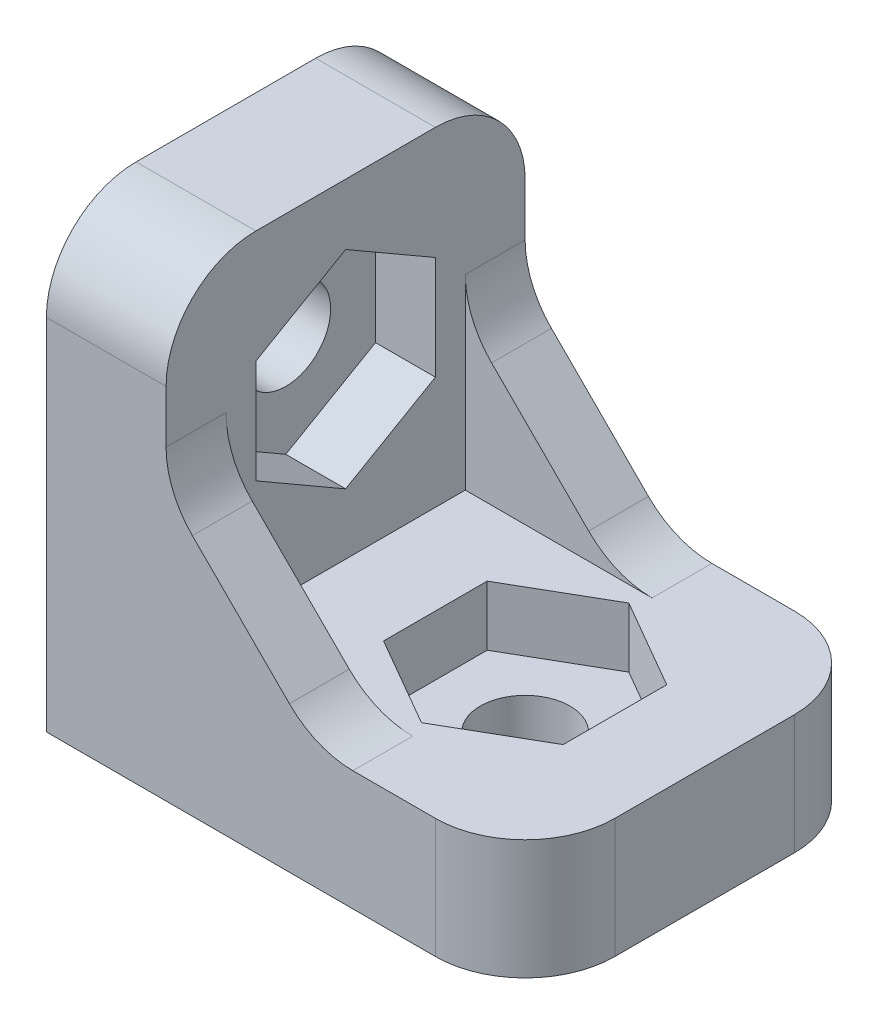
ISO-10303-21;
HEADER;
FILE_DESCRIPTION(('STEP AP214'),'2;1');
FILE_NAME('part.step','',(''),(''),'','','');
FILE_SCHEMA(('AUTOMOTIVE_DESIGN { 1 0 10303 214 1 1 1 1 }'));
ENDSEC;
DATA;
#1=APPLICATION_CONTEXT('core data for automotive mechanical design processes');
#2=APPLICATION_PROTOCOL_DEFINITION('international standard','automotive_design',2000,#1);
#3=PRODUCT_CONTEXT('',#1,'mechanical');
#4=PRODUCT('Part','Part','',(#3));
#5=PRODUCT_RELATED_PRODUCT_CATEGORY('part','',(#4));
#6=PRODUCT_DEFINITION_FORMATION('','',#4);
#7=PRODUCT_DEFINITION_CONTEXT('part definition',#1,'design');
#8=PRODUCT_DEFINITION('design','',#6,#7);
#9=PRODUCT_DEFINITION_SHAPE('','',#8);
#10=(LENGTH_UNIT() NAMED_UNIT(*) SI_UNIT(.MILLI.,.METRE.));
#11=(NAMED_UNIT(*) PLANE_ANGLE_UNIT() SI_UNIT($,.RADIAN.));
#12=(NAMED_UNIT(*) SI_UNIT($,.STERADIAN.) SOLID_ANGLE_UNIT());
#13=UNCERTAINTY_MEASURE_WITH_UNIT(LENGTH_MEASURE(1.E-05),#10,'distance_accuracy_value','');
#14=(GEOMETRIC_REPRESENTATION_CONTEXT(3) GLOBAL_UNCERTAINTY_ASSIGNED_CONTEXT((#13)) GLOBAL_UNIT_ASSIGNED_CONTEXT((#10,
#11,#12)) REPRESENTATION_CONTEXT('',''));
#15=CARTESIAN_POINT('',(0.,0.,0.));
#16=DIRECTION('',(0.,0.,1.));
#17=DIRECTION('',(1.,0.,0.));
#18=AXIS2_PLACEMENT_3D('',#15,#16,#17);
#19=CARTESIAN_POINT('',(10.,15.,6.));
#20=DIRECTION('',(0.,-1.,0.));
#21=DIRECTION('',(1.,0.,0.));
#22=AXIS2_PLACEMENT_3D('',#19,#20,#21);
#23=CYLINDRICAL_SURFACE('',#22,1.5);
#24=CARTESIAN_POINT('',(10.,0.,6.));
#25=DIRECTION('',(0.,-1.,0.));
#26=DIRECTION('',(1.,0.,0.));
#27=AXIS2_PLACEMENT_3D('',#24,#25,#26);
#28=CIRCLE('',#27,1.5);
#29=CARTESIAN_POINT('',(11.5,0.,6.));
#30=VERTEX_POINT('',#29);
#31=EDGE_CURVE('E281',#30,#30,#28,.T.);
#32=ORIENTED_EDGE('',*,*,#31,.T.);
#33=EDGE_LOOP('',(#32));
#34=FACE_BOUND('',#33,.T.);
#35=CARTESIAN_POINT('',(10.,2.,6.));
#36=DIRECTION('',(0.,1.,0.));
#37=DIRECTION('',(0.,0.,1.));
#38=AXIS2_PLACEMENT_3D('',#35,#36,#37);
#39=CIRCLE('',#38,1.5);
#40=CARTESIAN_POINT('',(10.,2.,7.5));
#41=VERTEX_POINT('',#40);
#42=EDGE_CURVE('E278',#41,#41,#39,.F.);
#43=ORIENTED_EDGE('',*,*,#42,.F.);
#44=EDGE_LOOP('',(#43));
#45=FACE_BOUND('',#44,.T.);
#46=ADVANCED_FACE('F33',(#34,#45),#23,.F.);
#47=CARTESIAN_POINT('',(0.,9.5,6.));
#48=DIRECTION('',(1.,0.,0.));
#49=DIRECTION('',(0.,1.,0.));
#50=AXIS2_PLACEMENT_3D('',#47,#48,#49);
#51=CYLINDRICAL_SURFACE('',#50,1.5);
#52=CARTESIAN_POINT('',(0.,9.5,6.));
#53=DIRECTION('',(1.,0.,0.));
#54=DIRECTION('',(0.,1.,0.));
#55=AXIS2_PLACEMENT_3D('',#52,#53,#54);
#56=CIRCLE('',#55,1.5);
#57=CARTESIAN_POINT('',(0.,11.,6.));
#58=VERTEX_POINT('',#57);
#59=EDGE_CURVE('E276',#58,#58,#56,.T.);
#60=ORIENTED_EDGE('',*,*,#59,.F.);
#61=EDGE_LOOP('',(#60));
#62=FACE_BOUND('',#61,.T.);
#63=CARTESIAN_POINT('',(2.,9.5,6.));
#64=DIRECTION('',(1.,0.,0.));
#65=DIRECTION('',(0.,0.,-1.));
#66=AXIS2_PLACEMENT_3D('',#63,#64,#65);
#67=CIRCLE('',#66,1.5);
#68=CARTESIAN_POINT('',(2.,9.5,4.5));
#69=VERTEX_POINT('',#68);
#70=EDGE_CURVE('E273',#69,#69,#67,.F.);
#71=ORIENTED_EDGE('',*,*,#70,.F.);
#72=EDGE_LOOP('',(#71));
#73=FACE_BOUND('',#72,.T.);
#74=ADVANCED_FACE('F550',(#62,#73),#51,.F.);
#75=CARTESIAN_POINT('',(16.,0.,12.));
#76=DIRECTION('',(0.,1.,0.));
#77=DIRECTION('',(-1.,0.,0.));
#78=AXIS2_PLACEMENT_3D('',#75,#76,#77);
#79=PLANE('',#78);
#80=ORIENTED_EDGE('',*,*,#31,.F.);
#81=EDGE_LOOP('',(#80));
#82=FACE_BOUND('',#81,.T.);
#83=DIRECTION('',(1.,0.,0.));
#84=VECTOR('',#83,1.);
#85=CARTESIAN_POINT('',(16.,0.,0.));
#86=LINE('',#85,#84);
#87=CARTESIAN_POINT('',(0.,0.,0.));
#88=VERTEX_POINT('',#87);
#89=CARTESIAN_POINT('',(13.,0.,0.));
#90=VERTEX_POINT('',#89);
#91=EDGE_CURVE('E357',#88,#90,#86,.T.);
#92=ORIENTED_EDGE('',*,*,#91,.T.);
#93=CARTESIAN_POINT('',(13.,0.,3.));
#94=DIRECTION('',(0.,1.,0.));
#95=DIRECTION('',(-1.,0.,0.));
#96=AXIS2_PLACEMENT_3D('',#93,#94,#95);
#97=CIRCLE('',#96,3.);
#98=CARTESIAN_POINT('',(16.,0.,3.));
#99=VERTEX_POINT('',#98);
#100=EDGE_CURVE('E319',#90,#99,#97,.F.);
#101=ORIENTED_EDGE('',*,*,#100,.T.);
#102=DIRECTION('',(0.,0.,-1.));
#103=VECTOR('',#102,1.);
#104=CARTESIAN_POINT('',(16.,0.,12.));
#105=LINE('',#104,#103);
#106=CARTESIAN_POINT('',(16.,0.,9.));
#107=VERTEX_POINT('',#106);
#108=EDGE_CURVE('E263',#107,#99,#105,.T.);
#109=ORIENTED_EDGE('',*,*,#108,.F.);
#110=CARTESIAN_POINT('',(13.,0.,9.));
#111=DIRECTION('',(0.,1.,0.));
#112=DIRECTION('',(-1.,0.,0.));
#113=AXIS2_PLACEMENT_3D('',#110,#111,#112);
#114=CIRCLE('',#113,3.);
#115=CARTESIAN_POINT('',(13.,0.,12.));
#116=VERTEX_POINT('',#115);
#117=EDGE_CURVE('E317',#107,#116,#114,.F.);
#118=ORIENTED_EDGE('',*,*,#117,.T.);
#119=DIRECTION('',(1.,0.,0.));
#120=VECTOR('',#119,1.);
#121=CARTESIAN_POINT('',(16.,0.,12.));
#122=LINE('',#121,#120);
#123=CARTESIAN_POINT('',(0.,0.,12.));
#124=VERTEX_POINT('',#123);
#125=EDGE_CURVE('E473',#124,#116,#122,.T.);
#126=ORIENTED_EDGE('',*,*,#125,.F.);
#127=DIRECTION('',(0.,0.,-1.));
#128=VECTOR('',#127,1.);
#129=CARTESIAN_POINT('',(0.,0.,12.));
#130=LINE('',#129,#128);
#131=EDGE_CURVE('E485',#124,#88,#130,.T.);
#132=ORIENTED_EDGE('',*,*,#131,.T.);
#133=EDGE_LOOP('',(#92,#101,#109,#118,#126,#132));
#134=FACE_BOUND('',#133,.T.);
#135=ADVANCED_FACE('F534',(#82,#134),#79,.F.);
#136=CARTESIAN_POINT('',(16.,4.,12.));
#137=DIRECTION('',(-1.,0.,0.));
#138=DIRECTION('',(0.,0.,1.));
#139=AXIS2_PLACEMENT_3D('',#136,#137,#138);
#140=PLANE('',#139);
#141=ORIENTED_EDGE('',*,*,#108,.T.);
#142=DIRECTION('',(0.,1.,0.));
#143=VECTOR('',#142,1.);
#144=CARTESIAN_POINT('',(16.,4.,3.));
#145=LINE('',#144,#143);
#146=CARTESIAN_POINT('',(16.,4.,3.));
#147=VERTEX_POINT('',#146);
#148=EDGE_CURVE('E310',#99,#147,#145,.T.);
#149=ORIENTED_EDGE('',*,*,#148,.T.);
#150=DIRECTION('',(0.,0.,-1.));
#151=VECTOR('',#150,1.);
#152=CARTESIAN_POINT('',(16.,4.,12.));
#153=LINE('',#152,#151);
#154=CARTESIAN_POINT('',(16.,4.,9.));
#155=VERTEX_POINT('',#154);
#156=EDGE_CURVE('E259',#155,#147,#153,.T.);
#157=ORIENTED_EDGE('',*,*,#156,.F.);
#158=DIRECTION('',(0.,1.,0.));
#159=VECTOR('',#158,1.);
#160=CARTESIAN_POINT('',(16.,4.,9.));
#161=LINE('',#160,#159);
#162=EDGE_CURVE('E308',#155,#107,#161,.F.);
#163=ORIENTED_EDGE('',*,*,#162,.T.);
#164=EDGE_LOOP('',(#141,#149,#157,#163));
#165=FACE_BOUND('',#164,.T.);
#166=ADVANCED_FACE('F526',(#165),#140,.F.);
#167=CARTESIAN_POINT('',(4.,4.,12.));
#168=DIRECTION('',(0.,-1.,0.));
#169=DIRECTION('',(0.,0.,-1.));
#170=AXIS2_PLACEMENT_3D('',#167,#168,#169);
#171=PLANE('',#170);
#172=DIRECTION('',(0.866025403784439,0.,-0.5));
#173=VECTOR('',#172,1.);
#174=CARTESIAN_POINT('',(10.,4.,9.46410161513779));
#175=LINE('',#174,#173);
#176=CARTESIAN_POINT('',(10.,4.,9.46410161513779));
#177=VERTEX_POINT('',#176);
#178=CARTESIAN_POINT('',(13.,4.,7.73205080756889));
#179=VERTEX_POINT('',#178);
#180=EDGE_CURVE('E372',#177,#179,#175,.T.);
#181=ORIENTED_EDGE('',*,*,#180,.F.);
#182=DIRECTION('',(0.866025403784439,0.,0.5));
#183=VECTOR('',#182,1.);
#184=CARTESIAN_POINT('',(6.99999999999997,4.,7.73205080756889));
#185=LINE('',#184,#183);
#186=CARTESIAN_POINT('',(6.99999999999997,4.,7.73205080756889));
#187=VERTEX_POINT('',#186);
#188=EDGE_CURVE('E369',#187,#177,#185,.T.);
#189=ORIENTED_EDGE('',*,*,#188,.F.);
#190=DIRECTION('',(0.,0.,1.));
#191=VECTOR('',#190,1.);
#192=CARTESIAN_POINT('',(6.99999999999997,4.,4.26794919243111));
#193=LINE('',#192,#191);
#194=CARTESIAN_POINT('',(6.99999999999997,4.,4.26794919243111));
#195=VERTEX_POINT('',#194);
#196=EDGE_CURVE('E382',#195,#187,#193,.T.);
#197=ORIENTED_EDGE('',*,*,#196,.F.);
#198=DIRECTION('',(-0.866025403784439,0.,0.5));
#199=VECTOR('',#198,1.);
#200=CARTESIAN_POINT('',(10.,4.,2.53589838486221));
#201=LINE('',#200,#199);
#202=CARTESIAN_POINT('',(10.,4.,2.53589838486221));
#203=VERTEX_POINT('',#202);
#204=EDGE_CURVE('E406',#203,#195,#201,.T.);
#205=ORIENTED_EDGE('',*,*,#204,.F.);
#206=DIRECTION('',(-0.866025403784439,0.,-0.5));
#207=VECTOR('',#206,1.);
#208=CARTESIAN_POINT('',(13.,4.,4.26794919243111));
#209=LINE('',#208,#207);
#210=CARTESIAN_POINT('',(13.,4.,4.26794919243111));
#211=VERTEX_POINT('',#210);
#212=EDGE_CURVE('E403',#211,#203,#209,.T.);
#213=ORIENTED_EDGE('',*,*,#212,.F.);
#214=DIRECTION('',(0.,0.,-1.));
#215=VECTOR('',#214,1.);
#216=CARTESIAN_POINT('',(13.,4.,7.73205080756889));
#217=LINE('',#216,#215);
#218=EDGE_CURVE('E400',#179,#211,#217,.T.);
#219=ORIENTED_EDGE('',*,*,#218,.F.);
#220=EDGE_LOOP('',(#181,#189,#197,#205,#213,#219));
#221=FACE_BOUND('',#220,.T.);
#222=DIRECTION('',(1.,0.,0.));
#223=VECTOR('',#222,1.);
#224=CARTESIAN_POINT('',(4.,4.,10.));
#225=LINE('',#224,#223);
#226=CARTESIAN_POINT('',(4.,4.,10.));
#227=VERTEX_POINT('',#226);
#228=CARTESIAN_POINT('',(10.2426406871193,4.,10.));
#229=VERTEX_POINT('',#228);
#230=EDGE_CURVE('E230',#227,#229,#225,.T.);
#231=ORIENTED_EDGE('',*,*,#230,.T.);
#232=DIRECTION('',(0.,0.,1.));
#233=VECTOR('',#232,1.);
#234=CARTESIAN_POINT('',(10.2426406871193,4.,12.));
#235=LINE('',#234,#233);
#236=CARTESIAN_POINT('',(10.2426406871193,4.,12.));
#237=VERTEX_POINT('',#236);
#238=EDGE_CURVE('E288',#229,#237,#235,.T.);
#239=ORIENTED_EDGE('',*,*,#238,.T.);
#240=DIRECTION('',(-1.,0.,0.));
#241=VECTOR('',#240,1.);
#242=CARTESIAN_POINT('',(4.,4.,12.));
#243=LINE('',#242,#241);
#244=CARTESIAN_POINT('',(13.,4.,12.));
#245=VERTEX_POINT('',#244);
#246=EDGE_CURVE('E476',#245,#237,#243,.T.);
#247=ORIENTED_EDGE('',*,*,#246,.F.);
#248=CARTESIAN_POINT('',(13.,4.,9.));
#249=DIRECTION('',(0.,-1.,0.));
#250=DIRECTION('',(0.,0.,-1.));
#251=AXIS2_PLACEMENT_3D('',#248,#249,#250);
#252=CIRCLE('',#251,3.);
#253=EDGE_CURVE('E272',#245,#155,#252,.F.);
#254=ORIENTED_EDGE('',*,*,#253,.T.);
#255=ORIENTED_EDGE('',*,*,#156,.T.);
#256=CARTESIAN_POINT('',(13.,4.,3.));
#257=DIRECTION('',(0.,-1.,0.));
#258=DIRECTION('',(0.,0.,-1.));
#259=AXIS2_PLACEMENT_3D('',#256,#257,#258);
#260=CIRCLE('',#259,3.);
#261=CARTESIAN_POINT('',(13.,4.,0.));
#262=VERTEX_POINT('',#261);
#263=EDGE_CURVE('E284',#147,#262,#260,.F.);
#264=ORIENTED_EDGE('',*,*,#263,.T.);
#265=DIRECTION('',(-1.,0.,0.));
#266=VECTOR('',#265,1.);
#267=CARTESIAN_POINT('',(4.,4.,0.));
#268=LINE('',#267,#266);
#269=CARTESIAN_POINT('',(10.2426406871193,4.,0.));
#270=VERTEX_POINT('',#269);
#271=EDGE_CURVE('E349',#262,#270,#268,.T.);
#272=ORIENTED_EDGE('',*,*,#271,.T.);
#273=DIRECTION('',(0.,0.,-1.));
#274=VECTOR('',#273,1.);
#275=CARTESIAN_POINT('',(10.2426406871193,4.,12.));
#276=LINE('',#275,#274);
#277=CARTESIAN_POINT('',(10.2426406871193,4.,2.));
#278=VERTEX_POINT('',#277);
#279=EDGE_CURVE('E286',#270,#278,#276,.F.);
#280=ORIENTED_EDGE('',*,*,#279,.T.);
#281=DIRECTION('',(-1.,0.,0.));
#282=VECTOR('',#281,1.);
#283=CARTESIAN_POINT('',(9.,4.,2.));
#284=LINE('',#283,#282);
#285=CARTESIAN_POINT('',(4.,4.,2.));
#286=VERTEX_POINT('',#285);
#287=EDGE_CURVE('E257',#278,#286,#284,.T.);
#288=ORIENTED_EDGE('',*,*,#287,.T.);
#289=DIRECTION('',(0.,0.,-1.));
#290=VECTOR('',#289,1.);
#291=CARTESIAN_POINT('',(4.,4.,12.));
#292=LINE('',#291,#290);
#293=EDGE_CURVE('E248',#227,#286,#292,.T.);
#294=ORIENTED_EDGE('',*,*,#293,.F.);
#295=EDGE_LOOP('',(#231,#239,#247,#254,#255,#264,#272,#280,#288,#294));
#296=FACE_BOUND('',#295,.T.);
#297=ADVANCED_FACE('F255',(#221,#296),#171,.F.);
#298=CARTESIAN_POINT('',(4.,15.,12.));
#299=DIRECTION('',(-1.,0.,0.));
#300=DIRECTION('',(0.,-1.,0.));
#301=AXIS2_PLACEMENT_3D('',#298,#299,#300);
#302=PLANE('',#301);
#303=DIRECTION('',(0.,-0.5,0.866025403784439));
#304=VECTOR('',#303,1.);
#305=CARTESIAN_POINT('',(4.,12.9641016151378,6.));
#306=LINE('',#305,#304);
#307=CARTESIAN_POINT('',(4.,12.9641016151378,6.));
#308=VERTEX_POINT('',#307);
#309=CARTESIAN_POINT('',(4.,11.2320508075689,9.));
#310=VERTEX_POINT('',#309);
#311=EDGE_CURVE('E446',#308,#310,#306,.T.);
#312=ORIENTED_EDGE('',*,*,#311,.F.);
#313=DIRECTION('',(0.,0.5,0.866025403784439));
#314=VECTOR('',#313,1.);
#315=CARTESIAN_POINT('',(4.,11.2320508075689,3.));
#316=LINE('',#315,#314);
#317=CARTESIAN_POINT('',(4.,11.2320508075689,3.));
#318=VERTEX_POINT('',#317);
#319=EDGE_CURVE('E424',#318,#308,#316,.T.);
#320=ORIENTED_EDGE('',*,*,#319,.F.);
#321=DIRECTION('',(0.,1.,0.));
#322=VECTOR('',#321,1.);
#323=CARTESIAN_POINT('',(4.,7.76794919243112,3.));
#324=LINE('',#323,#322);
#325=CARTESIAN_POINT('',(4.,7.76794919243112,3.));
#326=VERTEX_POINT('',#325);
#327=EDGE_CURVE('E429',#326,#318,#324,.T.);
#328=ORIENTED_EDGE('',*,*,#327,.F.);
#329=DIRECTION('',(0.,0.5,-0.866025403784439));
#330=VECTOR('',#329,1.);
#331=CARTESIAN_POINT('',(4.,6.03589838486224,6.));
#332=LINE('',#331,#330);
#333=CARTESIAN_POINT('',(4.,6.03589838486224,6.));
#334=VERTEX_POINT('',#333);
#335=EDGE_CURVE('E455',#334,#326,#332,.T.);
#336=ORIENTED_EDGE('',*,*,#335,.F.);
#337=DIRECTION('',(0.,-0.5,-0.866025403784438));
#338=VECTOR('',#337,1.);
#339=CARTESIAN_POINT('',(4.,7.76794919243112,9.));
#340=LINE('',#339,#338);
#341=CARTESIAN_POINT('',(4.,7.76794919243112,9.));
#342=VERTEX_POINT('',#341);
#343=EDGE_CURVE('E452',#342,#334,#340,.T.);
#344=ORIENTED_EDGE('',*,*,#343,.F.);
#345=DIRECTION('',(0.,-1.,0.));
#346=VECTOR('',#345,1.);
#347=CARTESIAN_POINT('',(4.,11.2320508075689,9.));
#348=LINE('',#347,#346);
#349=EDGE_CURVE('E449',#310,#342,#348,.T.);
#350=ORIENTED_EDGE('',*,*,#349,.F.);
#351=EDGE_LOOP('',(#312,#320,#328,#336,#344,#350));
#352=FACE_BOUND('',#351,.T.);
#353=DIRECTION('',(0.,1.,0.));
#354=VECTOR('',#353,1.);
#355=CARTESIAN_POINT('',(4.,15.,12.));
#356=LINE('',#355,#354);
#357=CARTESIAN_POINT('',(4.,10.2426406871193,12.));
#358=VERTEX_POINT('',#357);
#359=CARTESIAN_POINT('',(4.,12.,12.));
#360=VERTEX_POINT('',#359);
#361=EDGE_CURVE('E480',#358,#360,#356,.T.);
#362=ORIENTED_EDGE('',*,*,#361,.F.);
#363=DIRECTION('',(0.,0.,1.));
#364=VECTOR('',#363,1.);
#365=CARTESIAN_POINT('',(4.,10.2426406871193,12.));
#366=LINE('',#365,#364);
#367=CARTESIAN_POINT('',(4.,10.2426406871193,10.));
#368=VERTEX_POINT('',#367);
#369=EDGE_CURVE('E251',#358,#368,#366,.F.);
#370=ORIENTED_EDGE('',*,*,#369,.T.);
#371=DIRECTION('',(0.,-1.,0.));
#372=VECTOR('',#371,1.);
#373=CARTESIAN_POINT('',(4.,9.,10.));
#374=LINE('',#373,#372);
#375=EDGE_CURVE('E233',#368,#227,#374,.T.);
#376=ORIENTED_EDGE('',*,*,#375,.T.);
#377=ORIENTED_EDGE('',*,*,#293,.T.);
#378=DIRECTION('',(0.,1.,0.));
#379=VECTOR('',#378,1.);
#380=CARTESIAN_POINT('',(4.,4.,2.));
#381=LINE('',#380,#379);
#382=CARTESIAN_POINT('',(4.,10.2426406871193,2.));
#383=VERTEX_POINT('',#382);
#384=EDGE_CURVE('E370',#286,#383,#381,.T.);
#385=ORIENTED_EDGE('',*,*,#384,.T.);
#386=DIRECTION('',(0.,0.,-1.));
#387=VECTOR('',#386,1.);
#388=CARTESIAN_POINT('',(4.,10.2426406871193,12.));
#389=LINE('',#388,#387);
#390=CARTESIAN_POINT('',(4.,10.2426406871193,0.));
#391=VERTEX_POINT('',#390);
#392=EDGE_CURVE('E299',#383,#391,#389,.T.);
#393=ORIENTED_EDGE('',*,*,#392,.T.);
#394=DIRECTION('',(0.,1.,0.));
#395=VECTOR('',#394,1.);
#396=CARTESIAN_POINT('',(4.,15.,0.));
#397=LINE('',#396,#395);
#398=CARTESIAN_POINT('',(4.,12.,0.));
#399=VERTEX_POINT('',#398);
#400=EDGE_CURVE('E356',#391,#399,#397,.T.);
#401=ORIENTED_EDGE('',*,*,#400,.T.);
#402=CARTESIAN_POINT('',(4.,12.,3.));
#403=DIRECTION('',(-1.,0.,0.));
#404=DIRECTION('',(0.,-1.,0.));
#405=AXIS2_PLACEMENT_3D('',#402,#403,#404);
#406=CIRCLE('',#405,3.);
#407=CARTESIAN_POINT('',(4.,15.,3.));
#408=VERTEX_POINT('',#407);
#409=EDGE_CURVE('E295',#399,#408,#406,.F.);
#410=ORIENTED_EDGE('',*,*,#409,.T.);
#411=DIRECTION('',(0.,0.,-1.));
#412=VECTOR('',#411,1.);
#413=CARTESIAN_POINT('',(4.,15.,12.));
#414=LINE('',#413,#412);
#415=CARTESIAN_POINT('',(4.,15.,9.));
#416=VERTEX_POINT('',#415);
#417=EDGE_CURVE('E260',#416,#408,#414,.T.);
#418=ORIENTED_EDGE('',*,*,#417,.F.);
#419=CARTESIAN_POINT('',(4.,12.,9.));
#420=DIRECTION('',(-1.,0.,0.));
#421=DIRECTION('',(0.,-1.,0.));
#422=AXIS2_PLACEMENT_3D('',#419,#420,#421);
#423=CIRCLE('',#422,3.);
#424=EDGE_CURVE('E297',#416,#360,#423,.F.);
#425=ORIENTED_EDGE('',*,*,#424,.T.);
#426=EDGE_LOOP('',(#362,#370,#376,#377,#385,#393,#401,#410,#418,#425));
#427=FACE_BOUND('',#426,.T.);
#428=ADVANCED_FACE('F247',(#352,#427),#302,.F.);
#429=CARTESIAN_POINT('',(0.,15.,12.));
#430=DIRECTION('',(0.,-1.,0.));
#431=DIRECTION('',(0.,0.,-1.));
#432=AXIS2_PLACEMENT_3D('',#429,#430,#431);
#433=PLANE('',#432);
#434=DIRECTION('',(0.,0.,-1.));
#435=VECTOR('',#434,1.);
#436=CARTESIAN_POINT('',(0.,15.,12.));
#437=LINE('',#436,#435);
#438=CARTESIAN_POINT('',(0.,15.,9.));
#439=VERTEX_POINT('',#438);
#440=CARTESIAN_POINT('',(0.,15.,3.));
#441=VERTEX_POINT('',#440);
#442=EDGE_CURVE('E266',#439,#441,#437,.T.);
#443=ORIENTED_EDGE('',*,*,#442,.F.);
#444=DIRECTION('',(-1.,0.,0.));
#445=VECTOR('',#444,1.);
#446=CARTESIAN_POINT('',(0.,15.,9.));
#447=LINE('',#446,#445);
#448=EDGE_CURVE('E331',#439,#416,#447,.F.);
#449=ORIENTED_EDGE('',*,*,#448,.T.);
#450=ORIENTED_EDGE('',*,*,#417,.T.);
#451=DIRECTION('',(-1.,0.,0.));
#452=VECTOR('',#451,1.);
#453=CARTESIAN_POINT('',(0.,15.,3.));
#454=LINE('',#453,#452);
#455=EDGE_CURVE('E329',#408,#441,#454,.T.);
#456=ORIENTED_EDGE('',*,*,#455,.T.);
#457=EDGE_LOOP('',(#443,#449,#450,#456));
#458=FACE_BOUND('',#457,.T.);
#459=ADVANCED_FACE('F496',(#458),#433,.F.);
#460=CARTESIAN_POINT('',(0.,0.,12.));
#461=DIRECTION('',(1.,0.,0.));
#462=DIRECTION('',(0.,0.,-1.));
#463=AXIS2_PLACEMENT_3D('',#460,#461,#462);
#464=PLANE('',#463);
#465=ORIENTED_EDGE('',*,*,#59,.T.);
#466=EDGE_LOOP('',(#465));
#467=FACE_BOUND('',#466,.T.);
#468=DIRECTION('',(0.,-1.,0.));
#469=VECTOR('',#468,1.);
#470=CARTESIAN_POINT('',(0.,0.,12.));
#471=LINE('',#470,#469);
#472=CARTESIAN_POINT('',(0.,12.,12.));
#473=VERTEX_POINT('',#472);
#474=EDGE_CURVE('E483',#473,#124,#471,.T.);
#475=ORIENTED_EDGE('',*,*,#474,.F.);
#476=CARTESIAN_POINT('',(0.,12.,9.));
#477=DIRECTION('',(1.,0.,0.));
#478=DIRECTION('',(0.,0.,-1.));
#479=AXIS2_PLACEMENT_3D('',#476,#477,#478);
#480=CIRCLE('',#479,3.);
#481=EDGE_CURVE('E56',#473,#439,#480,.F.);
#482=ORIENTED_EDGE('',*,*,#481,.T.);
#483=ORIENTED_EDGE('',*,*,#442,.T.);
#484=CARTESIAN_POINT('',(0.,12.,3.));
#485=DIRECTION('',(1.,0.,0.));
#486=DIRECTION('',(0.,0.,-1.));
#487=AXIS2_PLACEMENT_3D('',#484,#485,#486);
#488=CIRCLE('',#487,3.);
#489=CARTESIAN_POINT('',(0.,12.,0.));
#490=VERTEX_POINT('',#489);
#491=EDGE_CURVE('E48',#441,#490,#488,.F.);
#492=ORIENTED_EDGE('',*,*,#491,.T.);
#493=DIRECTION('',(0.,-1.,0.));
#494=VECTOR('',#493,1.);
#495=CARTESIAN_POINT('',(0.,0.,0.));
#496=LINE('',#495,#494);
#497=EDGE_CURVE('E477',#490,#88,#496,.T.);
#498=ORIENTED_EDGE('',*,*,#497,.T.);
#499=ORIENTED_EDGE('',*,*,#131,.F.);
#500=EDGE_LOOP('',(#475,#482,#483,#492,#498,#499));
#501=FACE_BOUND('',#500,.T.);
#502=ADVANCED_FACE('F492',(#467,#501),#464,.F.);
#503=CARTESIAN_POINT('',(0.,0.,12.));
#504=DIRECTION('',(0.,0.,-1.));
#505=DIRECTION('',(-1.,0.,0.));
#506=AXIS2_PLACEMENT_3D('',#503,#504,#505);
#507=PLANE('',#506);
#508=ORIENTED_EDGE('',*,*,#125,.T.);
#509=DIRECTION('',(0.,1.,0.));
#510=VECTOR('',#509,1.);
#511=CARTESIAN_POINT('',(13.,0.,12.));
#512=LINE('',#511,#510);
#513=EDGE_CURVE('E324',#116,#245,#512,.T.);
#514=ORIENTED_EDGE('',*,*,#513,.T.);
#515=ORIENTED_EDGE('',*,*,#246,.T.);
#516=CARTESIAN_POINT('',(10.2426406871193,7.,12.));
#517=DIRECTION('',(0.,0.,-1.));
#518=DIRECTION('',(-1.,0.,0.));
#519=AXIS2_PLACEMENT_3D('',#516,#517,#518);
#520=CIRCLE('',#519,3.);
#521=CARTESIAN_POINT('',(8.12132034355964,4.87867965644036,12.));
#522=VERTEX_POINT('',#521);
#523=EDGE_CURVE('E333',#237,#522,#520,.T.);
#524=ORIENTED_EDGE('',*,*,#523,.T.);
#525=DIRECTION('',(-0.707106781186547,0.707106781186548,0.));
#526=VECTOR('',#525,1.);
#527=CARTESIAN_POINT('',(9.,4.,12.));
#528=LINE('',#527,#526);
#529=CARTESIAN_POINT('',(4.87867965644036,8.12132034355964,12.));
#530=VERTEX_POINT('',#529);
#531=EDGE_CURVE('E243',#522,#530,#528,.T.);
#532=ORIENTED_EDGE('',*,*,#531,.T.);
#533=CARTESIAN_POINT('',(7.,10.2426406871193,12.));
#534=DIRECTION('',(0.,0.,-1.));
#535=DIRECTION('',(-1.,0.,0.));
#536=AXIS2_PLACEMENT_3D('',#533,#534,#535);
#537=CIRCLE('',#536,3.);
#538=EDGE_CURVE('E336',#530,#358,#537,.T.);
#539=ORIENTED_EDGE('',*,*,#538,.T.);
#540=ORIENTED_EDGE('',*,*,#361,.T.);
#541=DIRECTION('',(-1.,0.,0.));
#542=VECTOR('',#541,1.);
#543=CARTESIAN_POINT('',(0.,12.,12.));
#544=LINE('',#543,#542);
#545=EDGE_CURVE('E321',#360,#473,#544,.T.);
#546=ORIENTED_EDGE('',*,*,#545,.T.);
#547=ORIENTED_EDGE('',*,*,#474,.T.);
#548=EDGE_LOOP('',(#508,#514,#515,#524,#532,#539,#540,#546,#547));
#549=FACE_BOUND('',#548,.T.);
#550=ADVANCED_FACE('F503',(#549),#507,.F.);
#551=CARTESIAN_POINT('',(0.,0.,0.));
#552=DIRECTION('',(0.,0.,-1.));
#553=DIRECTION('',(-1.,0.,0.));
#554=AXIS2_PLACEMENT_3D('',#551,#552,#553);
#555=PLANE('',#554);
#556=ORIENTED_EDGE('',*,*,#271,.F.);
#557=DIRECTION('',(0.,1.,0.));
#558=VECTOR('',#557,1.);
#559=CARTESIAN_POINT('',(13.,0.,0.));
#560=LINE('',#559,#558);
#561=EDGE_CURVE('E315',#262,#90,#560,.F.);
#562=ORIENTED_EDGE('',*,*,#561,.T.);
#563=ORIENTED_EDGE('',*,*,#91,.F.);
#564=ORIENTED_EDGE('',*,*,#497,.F.);
#565=DIRECTION('',(-1.,0.,0.));
#566=VECTOR('',#565,1.);
#567=CARTESIAN_POINT('',(4.,12.,0.));
#568=LINE('',#567,#566);
#569=EDGE_CURVE('E313',#490,#399,#568,.F.);
#570=ORIENTED_EDGE('',*,*,#569,.T.);
#571=ORIENTED_EDGE('',*,*,#400,.F.);
#572=CARTESIAN_POINT('',(7.,10.2426406871193,0.));
#573=DIRECTION('',(0.,0.,-1.));
#574=DIRECTION('',(-1.,0.,0.));
#575=AXIS2_PLACEMENT_3D('',#572,#573,#574);
#576=CIRCLE('',#575,3.);
#577=CARTESIAN_POINT('',(4.87867965644036,8.12132034355964,0.));
#578=VERTEX_POINT('',#577);
#579=EDGE_CURVE('E340',#391,#578,#576,.F.);
#580=ORIENTED_EDGE('',*,*,#579,.T.);
#581=DIRECTION('',(0.707106781186547,-0.707106781186548,0.));
#582=VECTOR('',#581,1.);
#583=CARTESIAN_POINT('',(4.,9.,0.));
#584=LINE('',#583,#582);
#585=CARTESIAN_POINT('',(8.12132034355964,4.87867965644036,0.));
#586=VERTEX_POINT('',#585);
#587=EDGE_CURVE('E253',#578,#586,#584,.T.);
#588=ORIENTED_EDGE('',*,*,#587,.T.);
#589=CARTESIAN_POINT('',(10.2426406871193,7.,0.));
#590=DIRECTION('',(0.,0.,-1.));
#591=DIRECTION('',(-1.,0.,0.));
#592=AXIS2_PLACEMENT_3D('',#589,#590,#591);
#593=CIRCLE('',#592,3.);
#594=EDGE_CURVE('E41',#586,#270,#593,.F.);
#595=ORIENTED_EDGE('',*,*,#594,.T.);
#596=EDGE_LOOP('',(#556,#562,#563,#564,#570,#571,#580,#588,#595));
#597=FACE_BOUND('',#596,.T.);
#598=ADVANCED_FACE('F348',(#597),#555,.T.);
#599=CARTESIAN_POINT('',(2.,0.,0.));
#600=DIRECTION('',(1.,0.,0.));
#601=DIRECTION('',(0.,0.,-1.));
#602=AXIS2_PLACEMENT_3D('',#599,#600,#601);
#603=PLANE('',#602);
#604=DIRECTION('',(0.,0.5,0.866025403784439));
#605=VECTOR('',#604,1.);
#606=CARTESIAN_POINT('',(2.,11.2320508075689,3.));
#607=LINE('',#606,#605);
#608=CARTESIAN_POINT('',(2.,11.2320508075689,3.));
#609=VERTEX_POINT('',#608);
#610=CARTESIAN_POINT('',(2.,12.9641016151378,6.));
#611=VERTEX_POINT('',#610);
#612=EDGE_CURVE('E425',#609,#611,#607,.T.);
#613=ORIENTED_EDGE('',*,*,#612,.T.);
#614=DIRECTION('',(0.,-0.5,0.866025403784439));
#615=VECTOR('',#614,1.);
#616=CARTESIAN_POINT('',(2.,12.9641016151378,6.));
#617=LINE('',#616,#615);
#618=CARTESIAN_POINT('',(2.,11.2320508075689,9.));
#619=VERTEX_POINT('',#618);
#620=EDGE_CURVE('E428',#611,#619,#617,.T.);
#621=ORIENTED_EDGE('',*,*,#620,.T.);
#622=DIRECTION('',(0.,-1.,0.));
#623=VECTOR('',#622,1.);
#624=CARTESIAN_POINT('',(2.,11.2320508075689,9.));
#625=LINE('',#624,#623);
#626=CARTESIAN_POINT('',(2.,7.76794919243112,9.));
#627=VERTEX_POINT('',#626);
#628=EDGE_CURVE('E432',#619,#627,#625,.T.);
#629=ORIENTED_EDGE('',*,*,#628,.T.);
#630=DIRECTION('',(0.,-0.5,-0.866025403784438));
#631=VECTOR('',#630,1.);
#632=CARTESIAN_POINT('',(2.,7.76794919243112,9.));
#633=LINE('',#632,#631);
#634=CARTESIAN_POINT('',(2.,6.03589838486224,6.));
#635=VERTEX_POINT('',#634);
#636=EDGE_CURVE('E435',#627,#635,#633,.T.);
#637=ORIENTED_EDGE('',*,*,#636,.T.);
#638=DIRECTION('',(0.,0.5,-0.866025403784439));
#639=VECTOR('',#638,1.);
#640=CARTESIAN_POINT('',(2.,6.03589838486224,6.));
#641=LINE('',#640,#639);
#642=CARTESIAN_POINT('',(2.,7.76794919243112,3.));
#643=VERTEX_POINT('',#642);
#644=EDGE_CURVE('E438',#635,#643,#641,.T.);
#645=ORIENTED_EDGE('',*,*,#644,.T.);
#646=DIRECTION('',(0.,1.,0.));
#647=VECTOR('',#646,1.);
#648=CARTESIAN_POINT('',(2.,7.76794919243112,3.));
#649=LINE('',#648,#647);
#650=EDGE_CURVE('E441',#643,#609,#649,.T.);
#651=ORIENTED_EDGE('',*,*,#650,.T.);
#652=EDGE_LOOP('',(#613,#621,#629,#637,#645,#651));
#653=FACE_BOUND('',#652,.T.);
#654=ORIENTED_EDGE('',*,*,#70,.T.);
#655=EDGE_LOOP('',(#654));
#656=FACE_BOUND('',#655,.T.);
#657=ADVANCED_FACE('F563',(#653,#656),#603,.T.);
#658=CARTESIAN_POINT('',(2.,11.2320508075689,3.));
#659=DIRECTION('',(0.,0.866025403784439,-0.5));
#660=DIRECTION('',(0.,0.5,0.866025403784439));
#661=AXIS2_PLACEMENT_3D('',#658,#659,#660);
#662=PLANE('',#661);
#663=ORIENTED_EDGE('',*,*,#319,.T.);
#664=DIRECTION('',(1.,0.,0.));
#665=VECTOR('',#664,1.);
#666=CARTESIAN_POINT('',(2.,12.9641016151378,6.));
#667=LINE('',#666,#665);
#668=EDGE_CURVE('E444',#611,#308,#667,.T.);
#669=ORIENTED_EDGE('',*,*,#668,.F.);
#670=ORIENTED_EDGE('',*,*,#612,.F.);
#671=DIRECTION('',(1.,0.,0.));
#672=VECTOR('',#671,1.);
#673=CARTESIAN_POINT('',(2.,11.2320508075689,3.));
#674=LINE('',#673,#672);
#675=EDGE_CURVE('E277',#609,#318,#674,.T.);
#676=ORIENTED_EDGE('',*,*,#675,.T.);
#677=EDGE_LOOP('',(#663,#669,#670,#676));
#678=FACE_BOUND('',#677,.T.);
#679=ADVANCED_FACE('F566',(#678),#662,.F.);
#680=CARTESIAN_POINT('',(2.,7.76794919243112,3.));
#681=DIRECTION('',(0.,0.,-1.));
#682=DIRECTION('',(-1.,0.,0.));
#683=AXIS2_PLACEMENT_3D('',#680,#681,#682);
#684=PLANE('',#683);
#685=ORIENTED_EDGE('',*,*,#327,.T.);
#686=ORIENTED_EDGE('',*,*,#675,.F.);
#687=ORIENTED_EDGE('',*,*,#650,.F.);
#688=DIRECTION('',(1.,0.,0.));
#689=VECTOR('',#688,1.);
#690=CARTESIAN_POINT('',(2.,7.76794919243112,3.));
#691=LINE('',#690,#689);
#692=EDGE_CURVE('E461',#643,#326,#691,.T.);
#693=ORIENTED_EDGE('',*,*,#692,.T.);
#694=EDGE_LOOP('',(#685,#686,#687,#693));
#695=FACE_BOUND('',#694,.T.);
#696=ADVANCED_FACE('F568',(#695),#684,.F.);
#697=CARTESIAN_POINT('',(2.,6.03589838486224,6.));
#698=DIRECTION('',(0.,-0.866025403784439,-0.5));
#699=DIRECTION('',(0.,0.5,-0.866025403784439));
#700=AXIS2_PLACEMENT_3D('',#697,#698,#699);
#701=PLANE('',#700);
#702=ORIENTED_EDGE('',*,*,#335,.T.);
#703=ORIENTED_EDGE('',*,*,#692,.F.);
#704=ORIENTED_EDGE('',*,*,#644,.F.);
#705=DIRECTION('',(1.,0.,0.));
#706=VECTOR('',#705,1.);
#707=CARTESIAN_POINT('',(2.,6.03589838486224,6.));
#708=LINE('',#707,#706);
#709=EDGE_CURVE('E463',#635,#334,#708,.T.);
#710=ORIENTED_EDGE('',*,*,#709,.T.);
#711=EDGE_LOOP('',(#702,#703,#704,#710));
#712=FACE_BOUND('',#711,.T.);
#713=ADVANCED_FACE('F571',(#712),#701,.F.);
#714=CARTESIAN_POINT('',(2.,7.76794919243112,9.));
#715=DIRECTION('',(0.,-0.866025403784438,0.5));
#716=DIRECTION('',(0.,-0.5,-0.866025403784438));
#717=AXIS2_PLACEMENT_3D('',#714,#715,#716);
#718=PLANE('',#717);
#719=ORIENTED_EDGE('',*,*,#343,.T.);
#720=ORIENTED_EDGE('',*,*,#709,.F.);
#721=ORIENTED_EDGE('',*,*,#636,.F.);
#722=DIRECTION('',(1.,0.,0.));
#723=VECTOR('',#722,1.);
#724=CARTESIAN_POINT('',(2.,7.76794919243112,9.));
#725=LINE('',#724,#723);
#726=EDGE_CURVE('E465',#627,#342,#725,.T.);
#727=ORIENTED_EDGE('',*,*,#726,.T.);
#728=EDGE_LOOP('',(#719,#720,#721,#727));
#729=FACE_BOUND('',#728,.T.);
#730=ADVANCED_FACE('F575',(#729),#718,.F.);
#731=CARTESIAN_POINT('',(2.,11.2320508075689,9.));
#732=DIRECTION('',(0.,0.,1.));
#733=DIRECTION('',(1.,0.,0.));
#734=AXIS2_PLACEMENT_3D('',#731,#732,#733);
#735=PLANE('',#734);
#736=ORIENTED_EDGE('',*,*,#349,.T.);
#737=ORIENTED_EDGE('',*,*,#726,.F.);
#738=ORIENTED_EDGE('',*,*,#628,.F.);
#739=DIRECTION('',(1.,0.,0.));
#740=VECTOR('',#739,1.);
#741=CARTESIAN_POINT('',(2.,11.2320508075689,9.));
#742=LINE('',#741,#740);
#743=EDGE_CURVE('E467',#619,#310,#742,.T.);
#744=ORIENTED_EDGE('',*,*,#743,.T.);
#745=EDGE_LOOP('',(#736,#737,#738,#744));
#746=FACE_BOUND('',#745,.T.);
#747=ADVANCED_FACE('F579',(#746),#735,.F.);
#748=CARTESIAN_POINT('',(2.,12.9641016151378,6.));
#749=DIRECTION('',(0.,0.866025403784439,0.5));
#750=DIRECTION('',(0.,-0.5,0.866025403784439));
#751=AXIS2_PLACEMENT_3D('',#748,#749,#750);
#752=PLANE('',#751);
#753=ORIENTED_EDGE('',*,*,#311,.T.);
#754=ORIENTED_EDGE('',*,*,#743,.F.);
#755=ORIENTED_EDGE('',*,*,#620,.F.);
#756=ORIENTED_EDGE('',*,*,#668,.T.);
#757=EDGE_LOOP('',(#753,#754,#755,#756));
#758=FACE_BOUND('',#757,.T.);
#759=ADVANCED_FACE('F583',(#758),#752,.F.);
#760=CARTESIAN_POINT('',(0.,2.,0.));
#761=DIRECTION('',(0.,1.,0.));
#762=DIRECTION('',(0.,0.,1.));
#763=AXIS2_PLACEMENT_3D('',#760,#761,#762);
#764=PLANE('',#763);
#765=DIRECTION('',(0.866025403784439,0.,0.5));
#766=VECTOR('',#765,1.);
#767=CARTESIAN_POINT('',(6.99999999999997,2.,7.73205080756889));
#768=LINE('',#767,#766);
#769=CARTESIAN_POINT('',(6.99999999999997,2.,7.73205080756889));
#770=VERTEX_POINT('',#769);
#771=CARTESIAN_POINT('',(10.,2.,9.46410161513779));
#772=VERTEX_POINT('',#771);
#773=EDGE_CURVE('E378',#770,#772,#768,.T.);
#774=ORIENTED_EDGE('',*,*,#773,.T.);
#775=DIRECTION('',(0.866025403784439,0.,-0.5));
#776=VECTOR('',#775,1.);
#777=CARTESIAN_POINT('',(10.,2.,9.46410161513779));
#778=LINE('',#777,#776);
#779=CARTESIAN_POINT('',(13.,2.,7.73205080756889));
#780=VERTEX_POINT('',#779);
#781=EDGE_CURVE('E381',#772,#780,#778,.T.);
#782=ORIENTED_EDGE('',*,*,#781,.T.);
#783=DIRECTION('',(0.,0.,-1.));
#784=VECTOR('',#783,1.);
#785=CARTESIAN_POINT('',(13.,2.,7.73205080756889));
#786=LINE('',#785,#784);
#787=CARTESIAN_POINT('',(13.,2.,4.26794919243111));
#788=VERTEX_POINT('',#787);
#789=EDGE_CURVE('E385',#780,#788,#786,.T.);
#790=ORIENTED_EDGE('',*,*,#789,.T.);
#791=DIRECTION('',(-0.866025403784439,0.,-0.5));
#792=VECTOR('',#791,1.);
#793=CARTESIAN_POINT('',(13.,2.,4.26794919243111));
#794=LINE('',#793,#792);
#795=CARTESIAN_POINT('',(10.,2.,2.53589838486221));
#796=VERTEX_POINT('',#795);
#797=EDGE_CURVE('E388',#788,#796,#794,.T.);
#798=ORIENTED_EDGE('',*,*,#797,.T.);
#799=DIRECTION('',(-0.866025403784439,0.,0.5));
#800=VECTOR('',#799,1.);
#801=CARTESIAN_POINT('',(10.,2.,2.53589838486221));
#802=LINE('',#801,#800);
#803=CARTESIAN_POINT('',(6.99999999999997,2.,4.26794919243111));
#804=VERTEX_POINT('',#803);
#805=EDGE_CURVE('E391',#796,#804,#802,.T.);
#806=ORIENTED_EDGE('',*,*,#805,.T.);
#807=DIRECTION('',(0.,0.,1.));
#808=VECTOR('',#807,1.);
#809=CARTESIAN_POINT('',(6.99999999999997,2.,4.26794919243111));
#810=LINE('',#809,#808);
#811=EDGE_CURVE('E394',#804,#770,#810,.T.);
#812=ORIENTED_EDGE('',*,*,#811,.T.);
#813=EDGE_LOOP('',(#774,#782,#790,#798,#806,#812));
#814=FACE_BOUND('',#813,.T.);
#815=ORIENTED_EDGE('',*,*,#42,.T.);
#816=EDGE_LOOP('',(#815));
#817=FACE_BOUND('',#816,.T.);
#818=ADVANCED_FACE('F587',(#814,#817),#764,.T.);
#819=CARTESIAN_POINT('',(6.99999999999997,2.,7.73205080756889));
#820=DIRECTION('',(-0.5,0.,0.866025403784439));
#821=DIRECTION('',(0.866025403784439,0.,0.5));
#822=AXIS2_PLACEMENT_3D('',#819,#820,#821);
#823=PLANE('',#822);
#824=ORIENTED_EDGE('',*,*,#188,.T.);
#825=DIRECTION('',(0.,1.,0.));
#826=VECTOR('',#825,1.);
#827=CARTESIAN_POINT('',(10.,2.,9.46410161513779));
#828=LINE('',#827,#826);
#829=EDGE_CURVE('E396',#772,#177,#828,.T.);
#830=ORIENTED_EDGE('',*,*,#829,.F.);
#831=ORIENTED_EDGE('',*,*,#773,.F.);
#832=DIRECTION('',(0.,1.,0.));
#833=VECTOR('',#832,1.);
#834=CARTESIAN_POINT('',(6.99999999999997,2.,7.73205080756889));
#835=LINE('',#834,#833);
#836=EDGE_CURVE('E282',#770,#187,#835,.T.);
#837=ORIENTED_EDGE('',*,*,#836,.T.);
#838=EDGE_LOOP('',(#824,#830,#831,#837));
#839=FACE_BOUND('',#838,.T.);
#840=ADVANCED_FACE('F561',(#839),#823,.F.);
#841=CARTESIAN_POINT('',(6.99999999999997,2.,4.26794919243111));
#842=DIRECTION('',(-1.,0.,0.));
#843=DIRECTION('',(0.,0.,1.));
#844=AXIS2_PLACEMENT_3D('',#841,#842,#843);
#845=PLANE('',#844);
#846=ORIENTED_EDGE('',*,*,#196,.T.);
#847=ORIENTED_EDGE('',*,*,#836,.F.);
#848=ORIENTED_EDGE('',*,*,#811,.F.);
#849=DIRECTION('',(0.,1.,0.));
#850=VECTOR('',#849,1.);
#851=CARTESIAN_POINT('',(6.99999999999997,2.,4.26794919243111));
#852=LINE('',#851,#850);
#853=EDGE_CURVE('E412',#804,#195,#852,.T.);
#854=ORIENTED_EDGE('',*,*,#853,.T.);
#855=EDGE_LOOP('',(#846,#847,#848,#854));
#856=FACE_BOUND('',#855,.T.);
#857=ADVANCED_FACE('F630',(#856),#845,.F.);
#858=CARTESIAN_POINT('',(10.,2.,2.53589838486221));
#859=DIRECTION('',(-0.5,0.,-0.866025403784439));
#860=DIRECTION('',(-0.866025403784439,0.,0.5));
#861=AXIS2_PLACEMENT_3D('',#858,#859,#860);
#862=PLANE('',#861);
#863=ORIENTED_EDGE('',*,*,#204,.T.);
#864=ORIENTED_EDGE('',*,*,#853,.F.);
#865=ORIENTED_EDGE('',*,*,#805,.F.);
#866=DIRECTION('',(0.,1.,0.));
#867=VECTOR('',#866,1.);
#868=CARTESIAN_POINT('',(10.,2.,2.53589838486221));
#869=LINE('',#868,#867);
#870=EDGE_CURVE('E414',#796,#203,#869,.T.);
#871=ORIENTED_EDGE('',*,*,#870,.T.);
#872=EDGE_LOOP('',(#863,#864,#865,#871));
#873=FACE_BOUND('',#872,.T.);
#874=ADVANCED_FACE('F633',(#873),#862,.F.);
#875=CARTESIAN_POINT('',(13.,2.,4.26794919243111));
#876=DIRECTION('',(0.5,0.,-0.866025403784439));
#877=DIRECTION('',(-0.866025403784439,0.,-0.5));
#878=AXIS2_PLACEMENT_3D('',#875,#876,#877);
#879=PLANE('',#878);
#880=ORIENTED_EDGE('',*,*,#212,.T.);
#881=ORIENTED_EDGE('',*,*,#870,.F.);
#882=ORIENTED_EDGE('',*,*,#797,.F.);
#883=DIRECTION('',(0.,1.,0.));
#884=VECTOR('',#883,1.);
#885=CARTESIAN_POINT('',(13.,2.,4.26794919243111));
#886=LINE('',#885,#884);
#887=EDGE_CURVE('E416',#788,#211,#886,.T.);
#888=ORIENTED_EDGE('',*,*,#887,.T.);
#889=EDGE_LOOP('',(#880,#881,#882,#888));
#890=FACE_BOUND('',#889,.T.);
#891=ADVANCED_FACE('F637',(#890),#879,.F.);
#892=CARTESIAN_POINT('',(13.,2.,7.73205080756889));
#893=DIRECTION('',(1.,0.,0.));
#894=DIRECTION('',(0.,0.,-1.));
#895=AXIS2_PLACEMENT_3D('',#892,#893,#894);
#896=PLANE('',#895);
#897=ORIENTED_EDGE('',*,*,#218,.T.);
#898=ORIENTED_EDGE('',*,*,#887,.F.);
#899=ORIENTED_EDGE('',*,*,#789,.F.);
#900=DIRECTION('',(0.,1.,0.));
#901=VECTOR('',#900,1.);
#902=CARTESIAN_POINT('',(13.,2.,7.73205080756889));
#903=LINE('',#902,#901);
#904=EDGE_CURVE('E418',#780,#179,#903,.T.);
#905=ORIENTED_EDGE('',*,*,#904,.T.);
#906=EDGE_LOOP('',(#897,#898,#899,#905));
#907=FACE_BOUND('',#906,.T.);
#908=ADVANCED_FACE('F641',(#907),#896,.F.);
#909=CARTESIAN_POINT('',(10.,2.,9.46410161513779));
#910=DIRECTION('',(0.5,0.,0.866025403784439));
#911=DIRECTION('',(0.866025403784439,0.,-0.5));
#912=AXIS2_PLACEMENT_3D('',#909,#910,#911);
#913=PLANE('',#912);
#914=ORIENTED_EDGE('',*,*,#180,.T.);
#915=ORIENTED_EDGE('',*,*,#904,.F.);
#916=ORIENTED_EDGE('',*,*,#781,.F.);
#917=ORIENTED_EDGE('',*,*,#829,.T.);
#918=EDGE_LOOP('',(#914,#915,#916,#917));
#919=FACE_BOUND('',#918,.T.);
#920=ADVANCED_FACE('F626',(#919),#913,.F.);
#921=CARTESIAN_POINT('',(4.,9.,2.));
#922=DIRECTION('',(0.707106781186548,0.707106781186547,0.));
#923=DIRECTION('',(-0.707106781186547,0.707106781186548,0.));
#924=AXIS2_PLACEMENT_3D('',#921,#922,#923);
#925=PLANE('',#924);
#926=ORIENTED_EDGE('',*,*,#587,.F.);
#927=DIRECTION('',(0.,0.,-1.));
#928=VECTOR('',#927,1.);
#929=CARTESIAN_POINT('',(4.87867965644036,8.12132034355964,2.));
#930=LINE('',#929,#928);
#931=CARTESIAN_POINT('',(4.87867965644036,8.12132034355964,2.));
#932=VERTEX_POINT('',#931);
#933=EDGE_CURVE('E306',#578,#932,#930,.F.);
#934=ORIENTED_EDGE('',*,*,#933,.T.);
#935=DIRECTION('',(0.707106781186547,-0.707106781186548,0.));
#936=VECTOR('',#935,1.);
#937=CARTESIAN_POINT('',(4.,9.,2.));
#938=LINE('',#937,#936);
#939=CARTESIAN_POINT('',(8.12132034355964,4.87867965644036,2.));
#940=VERTEX_POINT('',#939);
#941=EDGE_CURVE('E364',#932,#940,#938,.T.);
#942=ORIENTED_EDGE('',*,*,#941,.T.);
#943=DIRECTION('',(0.,0.,-1.));
#944=VECTOR('',#943,1.);
#945=CARTESIAN_POINT('',(8.12132034355964,4.87867965644036,2.));
#946=LINE('',#945,#944);
#947=EDGE_CURVE('E303',#940,#586,#946,.T.);
#948=ORIENTED_EDGE('',*,*,#947,.T.);
#949=EDGE_LOOP('',(#926,#934,#942,#948));
#950=FACE_BOUND('',#949,.T.);
#951=ADVANCED_FACE('F367',(#950),#925,.T.);
#952=CARTESIAN_POINT('',(0.,0.,2.));
#953=DIRECTION('',(0.,0.,-1.));
#954=DIRECTION('',(-1.,0.,0.));
#955=AXIS2_PLACEMENT_3D('',#952,#953,#954);
#956=PLANE('',#955);
#957=ORIENTED_EDGE('',*,*,#287,.F.);
#958=CARTESIAN_POINT('',(10.2426406871193,7.,2.));
#959=DIRECTION('',(0.,0.,-1.));
#960=DIRECTION('',(-1.,0.,0.));
#961=AXIS2_PLACEMENT_3D('',#958,#959,#960);
#962=CIRCLE('',#961,3.);
#963=EDGE_CURVE('E11',#278,#940,#962,.T.);
#964=ORIENTED_EDGE('',*,*,#963,.T.);
#965=ORIENTED_EDGE('',*,*,#941,.F.);
#966=CARTESIAN_POINT('',(7.,10.2426406871193,2.));
#967=DIRECTION('',(0.,0.,-1.));
#968=DIRECTION('',(-1.,0.,0.));
#969=AXIS2_PLACEMENT_3D('',#966,#967,#968);
#970=CIRCLE('',#969,3.);
#971=EDGE_CURVE('E342',#932,#383,#970,.T.);
#972=ORIENTED_EDGE('',*,*,#971,.T.);
#973=ORIENTED_EDGE('',*,*,#384,.F.);
#974=EDGE_LOOP('',(#957,#964,#965,#972,#973));
#975=FACE_BOUND('',#974,.T.);
#976=ADVANCED_FACE('F363',(#975),#956,.F.);
#977=CARTESIAN_POINT('',(9.,4.,10.));
#978=DIRECTION('',(0.707106781186548,0.707106781186547,0.));
#979=DIRECTION('',(-0.707106781186547,0.707106781186548,0.));
#980=AXIS2_PLACEMENT_3D('',#977,#978,#979);
#981=PLANE('',#980);
#982=ORIENTED_EDGE('',*,*,#531,.F.);
#983=DIRECTION('',(0.,0.,1.));
#984=VECTOR('',#983,1.);
#985=CARTESIAN_POINT('',(8.12132034355964,4.87867965644036,10.));
#986=LINE('',#985,#984);
#987=CARTESIAN_POINT('',(8.12132034355964,4.87867965644036,10.));
#988=VERTEX_POINT('',#987);
#989=EDGE_CURVE('E293',#522,#988,#986,.F.);
#990=ORIENTED_EDGE('',*,*,#989,.T.);
#991=DIRECTION('',(-0.707106781186547,0.707106781186548,0.));
#992=VECTOR('',#991,1.);
#993=CARTESIAN_POINT('',(9.,4.,10.));
#994=LINE('',#993,#992);
#995=CARTESIAN_POINT('',(4.87867965644036,8.12132034355964,10.));
#996=VERTEX_POINT('',#995);
#997=EDGE_CURVE('E242',#988,#996,#994,.T.);
#998=ORIENTED_EDGE('',*,*,#997,.T.);
#999=DIRECTION('',(0.,0.,1.));
#1000=VECTOR('',#999,1.);
#1001=CARTESIAN_POINT('',(4.87867965644036,8.12132034355964,10.));
#1002=LINE('',#1001,#1000);
#1003=EDGE_CURVE('E290',#996,#530,#1002,.T.);
#1004=ORIENTED_EDGE('',*,*,#1003,.T.);
#1005=EDGE_LOOP('',(#982,#990,#998,#1004));
#1006=FACE_BOUND('',#1005,.T.);
#1007=ADVANCED_FACE('F511',(#1006),#981,.T.);
#1008=CARTESIAN_POINT('',(0.,0.,10.));
#1009=DIRECTION('',(0.,0.,-1.));
#1010=DIRECTION('',(-1.,0.,0.));
#1011=AXIS2_PLACEMENT_3D('',#1008,#1009,#1010);
#1012=PLANE('',#1011);
#1013=ORIENTED_EDGE('',*,*,#230,.F.);
#1014=ORIENTED_EDGE('',*,*,#375,.F.);
#1015=CARTESIAN_POINT('',(7.,10.2426406871193,10.));
#1016=DIRECTION('',(0.,0.,-1.));
#1017=DIRECTION('',(-1.,0.,0.));
#1018=AXIS2_PLACEMENT_3D('',#1015,#1016,#1017);
#1019=CIRCLE('',#1018,3.);
#1020=EDGE_CURVE('E338',#368,#996,#1019,.F.);
#1021=ORIENTED_EDGE('',*,*,#1020,.T.);
#1022=ORIENTED_EDGE('',*,*,#997,.F.);
#1023=CARTESIAN_POINT('',(10.2426406871193,7.,10.));
#1024=DIRECTION('',(0.,0.,-1.));
#1025=DIRECTION('',(-1.,0.,0.));
#1026=AXIS2_PLACEMENT_3D('',#1023,#1024,#1025);
#1027=CIRCLE('',#1026,3.);
#1028=EDGE_CURVE('E237',#988,#229,#1027,.F.);
#1029=ORIENTED_EDGE('',*,*,#1028,.T.);
#1030=EDGE_LOOP('',(#1013,#1014,#1021,#1022,#1029));
#1031=FACE_BOUND('',#1030,.T.);
#1032=ADVANCED_FACE('F232',(#1031),#1012,.T.);
#1033=CARTESIAN_POINT('',(10.2426406871193,7.,12.));
#1034=DIRECTION('',(0.,0.,1.));
#1035=DIRECTION('',(1.,0.,0.));
#1036=AXIS2_PLACEMENT_3D('',#1033,#1034,#1035);
#1037=CYLINDRICAL_SURFACE('',#1036,3.);
#1038=ORIENTED_EDGE('',*,*,#1028,.F.);
#1039=ORIENTED_EDGE('',*,*,#989,.F.);
#1040=ORIENTED_EDGE('',*,*,#523,.F.);
#1041=ORIENTED_EDGE('',*,*,#238,.F.);
#1042=EDGE_LOOP('',(#1038,#1039,#1040,#1041));
#1043=FACE_BOUND('',#1042,.T.);
#1044=ADVANCED_FACE('F516',(#1043),#1037,.F.);
#1045=CARTESIAN_POINT('',(7.,10.2426406871193,10.));
#1046=DIRECTION('',(0.,0.,1.));
#1047=DIRECTION('',(1.,0.,0.));
#1048=AXIS2_PLACEMENT_3D('',#1045,#1046,#1047);
#1049=CYLINDRICAL_SURFACE('',#1048,3.);
#1050=ORIENTED_EDGE('',*,*,#1020,.F.);
#1051=ORIENTED_EDGE('',*,*,#369,.F.);
#1052=ORIENTED_EDGE('',*,*,#538,.F.);
#1053=ORIENTED_EDGE('',*,*,#1003,.F.);
#1054=EDGE_LOOP('',(#1050,#1051,#1052,#1053));
#1055=FACE_BOUND('',#1054,.T.);
#1056=ADVANCED_FACE('F508',(#1055),#1049,.F.);
#1057=CARTESIAN_POINT('',(7.,10.2426406871193,12.));
#1058=DIRECTION('',(0.,0.,-1.));
#1059=DIRECTION('',(-1.,0.,0.));
#1060=AXIS2_PLACEMENT_3D('',#1057,#1058,#1059);
#1061=CYLINDRICAL_SURFACE('',#1060,3.);
#1062=ORIENTED_EDGE('',*,*,#971,.F.);
#1063=ORIENTED_EDGE('',*,*,#933,.F.);
#1064=ORIENTED_EDGE('',*,*,#579,.F.);
#1065=ORIENTED_EDGE('',*,*,#392,.F.);
#1066=EDGE_LOOP('',(#1062,#1063,#1064,#1065));
#1067=FACE_BOUND('',#1066,.T.);
#1068=ADVANCED_FACE('F540',(#1067),#1061,.F.);
#1069=CARTESIAN_POINT('',(10.2426406871193,7.,2.));
#1070=DIRECTION('',(0.,0.,-1.));
#1071=DIRECTION('',(-1.,0.,0.));
#1072=AXIS2_PLACEMENT_3D('',#1069,#1070,#1071);
#1073=CYLINDRICAL_SURFACE('',#1072,3.);
#1074=ORIENTED_EDGE('',*,*,#963,.F.);
#1075=ORIENTED_EDGE('',*,*,#279,.F.);
#1076=ORIENTED_EDGE('',*,*,#594,.F.);
#1077=ORIENTED_EDGE('',*,*,#947,.F.);
#1078=EDGE_LOOP('',(#1074,#1075,#1076,#1077));
#1079=FACE_BOUND('',#1078,.T.);
#1080=ADVANCED_FACE('F359',(#1079),#1073,.F.);
#1081=CARTESIAN_POINT('',(13.,4.,3.));
#1082=DIRECTION('',(0.,-1.,0.));
#1083=DIRECTION('',(0.,0.,-1.));
#1084=AXIS2_PLACEMENT_3D('',#1081,#1082,#1083);
#1085=CYLINDRICAL_SURFACE('',#1084,3.);
#1086=ORIENTED_EDGE('',*,*,#100,.F.);
#1087=ORIENTED_EDGE('',*,*,#561,.F.);
#1088=ORIENTED_EDGE('',*,*,#263,.F.);
#1089=ORIENTED_EDGE('',*,*,#148,.F.);
#1090=EDGE_LOOP('',(#1086,#1087,#1088,#1089));
#1091=FACE_BOUND('',#1090,.T.);
#1092=ADVANCED_FACE('F531',(#1091),#1085,.T.);
#1093=CARTESIAN_POINT('',(13.,0.,9.));
#1094=DIRECTION('',(0.,1.,0.));
#1095=DIRECTION('',(0.,0.,1.));
#1096=AXIS2_PLACEMENT_3D('',#1093,#1094,#1095);
#1097=CYLINDRICAL_SURFACE('',#1096,3.);
#1098=ORIENTED_EDGE('',*,*,#117,.F.);
#1099=ORIENTED_EDGE('',*,*,#162,.F.);
#1100=ORIENTED_EDGE('',*,*,#253,.F.);
#1101=ORIENTED_EDGE('',*,*,#513,.F.);
#1102=EDGE_LOOP('',(#1098,#1099,#1100,#1101));
#1103=FACE_BOUND('',#1102,.T.);
#1104=ADVANCED_FACE('F522',(#1103),#1097,.T.);
#1105=CARTESIAN_POINT('',(0.,12.,9.));
#1106=DIRECTION('',(-1.,0.,0.));
#1107=DIRECTION('',(0.,0.,1.));
#1108=AXIS2_PLACEMENT_3D('',#1105,#1106,#1107);
#1109=CYLINDRICAL_SURFACE('',#1108,3.);
#1110=ORIENTED_EDGE('',*,*,#424,.F.);
#1111=ORIENTED_EDGE('',*,*,#448,.F.);
#1112=ORIENTED_EDGE('',*,*,#481,.F.);
#1113=ORIENTED_EDGE('',*,*,#545,.F.);
#1114=EDGE_LOOP('',(#1110,#1111,#1112,#1113));
#1115=FACE_BOUND('',#1114,.T.);
#1116=ADVANCED_FACE('F500',(#1115),#1109,.T.);
#1117=CARTESIAN_POINT('',(0.,12.,3.));
#1118=DIRECTION('',(1.,0.,0.));
#1119=DIRECTION('',(0.,0.,-1.));
#1120=AXIS2_PLACEMENT_3D('',#1117,#1118,#1119);
#1121=CYLINDRICAL_SURFACE('',#1120,3.);
#1122=ORIENTED_EDGE('',*,*,#409,.F.);
#1123=ORIENTED_EDGE('',*,*,#569,.F.);
#1124=ORIENTED_EDGE('',*,*,#491,.F.);
#1125=ORIENTED_EDGE('',*,*,#455,.F.);
#1126=EDGE_LOOP('',(#1122,#1123,#1124,#1125));
#1127=FACE_BOUND('',#1126,.T.);
#1128=ADVANCED_FACE('F35',(#1127),#1121,.T.);
#1129=CLOSED_SHELL('',(#46,#74,#135,#166,#297,#428,#459,#502,#550,#598,#657,#679,#696,#713,#730,
#747,#759,#818,#840,#857,#874,#891,#908,#920,#951,#976,#1007,#1032,#1044,#1056,#1068,#1080,
#1092,#1104,#1116,#1128));
#1130=MANIFOLD_SOLID_BREP('B2',#1129);
#1131=ADVANCED_BREP_SHAPE_REPRESENTATION('',(#18,#1130),#14);
#1132=SHAPE_DEFINITION_REPRESENTATION(#9,#1131);
ENDSEC;
END-ISO-10303-21;
